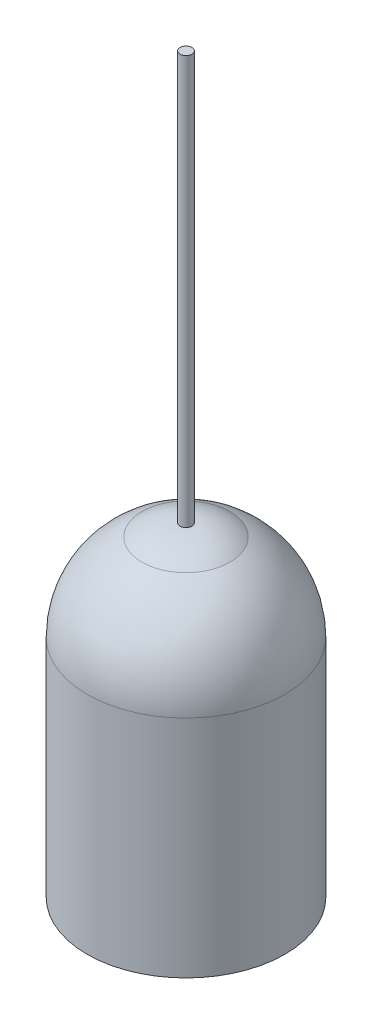
ISO-10303-21;
HEADER;
FILE_DESCRIPTION(('STEP AP214'),'2;1');
FILE_NAME('part.step','',(''),(''),'','','');
FILE_SCHEMA(('AUTOMOTIVE_DESIGN { 1 0 10303 214 1 1 1 1 }'));
ENDSEC;
DATA;
#1=APPLICATION_CONTEXT('core data for automotive mechanical design processes');
#2=APPLICATION_PROTOCOL_DEFINITION('international standard','automotive_design',2000,#1);
#3=PRODUCT_CONTEXT('',#1,'mechanical');
#4=PRODUCT('Part','Part','',(#3));
#5=PRODUCT_RELATED_PRODUCT_CATEGORY('part','',(#4));
#6=PRODUCT_DEFINITION_FORMATION('','',#4);
#7=PRODUCT_DEFINITION_CONTEXT('part definition',#1,'design');
#8=PRODUCT_DEFINITION('design','',#6,#7);
#9=PRODUCT_DEFINITION_SHAPE('','',#8);
#10=(LENGTH_UNIT() NAMED_UNIT(*) SI_UNIT(.MILLI.,.METRE.));
#11=(NAMED_UNIT(*) PLANE_ANGLE_UNIT() SI_UNIT($,.RADIAN.));
#12=(NAMED_UNIT(*) SI_UNIT($,.STERADIAN.) SOLID_ANGLE_UNIT());
#13=UNCERTAINTY_MEASURE_WITH_UNIT(LENGTH_MEASURE(1.E-05),#10,'distance_accuracy_value','');
#14=(GEOMETRIC_REPRESENTATION_CONTEXT(3) GLOBAL_UNCERTAINTY_ASSIGNED_CONTEXT((#13)) GLOBAL_UNIT_ASSIGNED_CONTEXT((#10,
#11,#12)) REPRESENTATION_CONTEXT('',''));
#15=CARTESIAN_POINT('',(0.,0.,0.));
#16=DIRECTION('',(0.,0.,1.));
#17=DIRECTION('',(1.,0.,0.));
#18=AXIS2_PLACEMENT_3D('',#15,#16,#17);
#19=CARTESIAN_POINT('',(0.,73.07610726012,16.8867086076702));
#20=DIRECTION('',(0.,-1.,0.));
#21=DIRECTION('',(0.,0.,-1.));
#22=AXIS2_PLACEMENT_3D('',#19,#20,#21);
#23=PLANE('',#22);
#24=CARTESIAN_POINT('',(0.,73.07610726012,0.));
#25=DIRECTION('',(0.,-1.,0.));
#26=DIRECTION('',(0.,0.,-1.));
#27=AXIS2_PLACEMENT_3D('',#24,#25,#26);
#28=CIRCLE('',#27,16.8867086076702);
#29=CARTESIAN_POINT('',(0.,73.07610726012,-16.8867086076702));
#30=VERTEX_POINT('',#29);
#31=EDGE_CURVE('E74',#30,#30,#28,.T.);
#32=ORIENTED_EDGE('',*,*,#31,.F.);
#33=EDGE_LOOP('',(#32));
#34=FACE_BOUND('',#33,.T.);
#35=ADVANCED_FACE('F52',(#34),#23,.F.);
#36=CARTESIAN_POINT('',(0.,29.7676170992412,-0.721295350546137));
#37=DIRECTION('',(-1.,0.,0.));
#38=DIRECTION('',(0.,0.,-1.));
#39=AXIS2_PLACEMENT_3D('',#36,#37,#38);
#40=CIRCLE('',#39,5.62162671448313);
#41=TRIMMED_CURVE('',#40,(PARAMETER_VALUE(-1.69945823867487)),
(PARAMETER_VALUE(1.69945823867487)),.T.,.PARAMETER.);
#42=CARTESIAN_POINT('',(0.,29.7676170992412,0.));
#43=DIRECTION('',(0.,-1.,0.));
#44=AXIS1_PLACEMENT('',#42,#43);
#45=SURFACE_OF_REVOLUTION('',#41,#44);
#46=CARTESIAN_POINT('',(0.,24.1924561209133,0.));
#47=VERTEX_POINT('',#46);
#48=VERTEX_LOOP('',#47);
#49=FACE_BOUND('',#48,.T.);
#50=CARTESIAN_POINT('',(0.,29.0463217486948,0.));
#51=DIRECTION('',(0.,-1.,0.));
#52=DIRECTION('',(0.,0.,-1.));
#53=AXIS2_PLACEMENT_3D('',#50,#51,#52);
#54=CIRCLE('',#53,6.29645632887407);
#55=CARTESIAN_POINT('',(0.,29.0463217486948,-6.29645632887407));
#56=VERTEX_POINT('',#55);
#57=EDGE_CURVE('E12',#56,#56,#54,.T.);
#58=ORIENTED_EDGE('',*,*,#57,.T.);
#59=EDGE_LOOP('',(#58));
#60=FACE_BOUND('',#59,.T.);
#61=ADVANCED_FACE('F61',(#49,#60),#45,.T.);
#62=CARTESIAN_POINT('',(0.,52.2124986085608,0.));
#63=DIRECTION('',(0.,-1.,0.));
#64=DIRECTION('',(0.,0.,-1.));
#65=AXIS2_PLACEMENT_3D('',#62,#63,#64);
#66=DEGENERATE_TOROIDAL_SURFACE('',#65,1.66322095690172,23.6249575727595,.T.);
#67=ORIENTED_EDGE('',*,*,#57,.F.);
#68=EDGE_LOOP('',(#67));
#69=FACE_BOUND('',#68,.T.);
#70=CARTESIAN_POINT('',(0.,56.8457339805347,0.));
#71=DIRECTION('',(0.,-1.,0.));
#72=DIRECTION('',(0.,0.,-1.));
#73=AXIS2_PLACEMENT_3D('',#70,#71,#72);
#74=CIRCLE('',#73,24.8293978167673);
#75=CARTESIAN_POINT('',(0.,56.8457339805347,-24.8293978167673));
#76=VERTEX_POINT('',#75);
#77=EDGE_CURVE('E58',#76,#76,#74,.T.);
#78=ORIENTED_EDGE('',*,*,#77,.T.);
#79=EDGE_LOOP('',(#78));
#80=FACE_BOUND('',#79,.T.);
#81=ADVANCED_FACE('F64',(#69,#80),#66,.T.);
#82=CARTESIAN_POINT('',(0.,42.9762044490012,0.));
#83=DIRECTION('',(0.,-1.,0.));
#84=DIRECTION('',(0.,0.,-1.));
#85=AXIS2_PLACEMENT_3D('',#82,#83,#84);
#86=DEGENERATE_TOROIDAL_SURFACE('',#85,24.0662967796802,50.8247262608974,.F.);
#87=ORIENTED_EDGE('',*,*,#77,.F.);
#88=EDGE_LOOP('',(#87));
#89=FACE_BOUND('',#88,.T.);
#90=ORIENTED_EDGE('',*,*,#31,.T.);
#91=EDGE_LOOP('',(#90));
#92=FACE_BOUND('',#91,.T.);
#93=ADVANCED_FACE('F69',(#89,#92),#86,.F.);
#94=CLOSED_SHELL('',(#35,#61,#81,#93));
#95=MANIFOLD_SOLID_BREP('B2',#94);
#96=CARTESIAN_POINT('',(0.,786.384,0.));
#97=DIRECTION('',(0.,-1.,0.));
#98=DIRECTION('',(0.,0.,-1.));
#99=AXIS2_PLACEMENT_3D('',#96,#97,#98);
#100=CYLINDRICAL_SURFACE('',#99,7.99332991217101);
#101=CARTESIAN_POINT('',(0.,786.384,0.));
#102=DIRECTION('',(0.,1.,0.));
#103=DIRECTION('',(0.,0.,1.));
#104=AXIS2_PLACEMENT_3D('',#101,#102,#103);
#105=CIRCLE('',#104,7.99332991217101);
#106=CARTESIAN_POINT('',(0.,786.384,7.99332991217101));
#107=VERTEX_POINT('',#106);
#108=EDGE_CURVE('E131',#107,#107,#105,.T.);
#109=ORIENTED_EDGE('',*,*,#108,.F.);
#110=EDGE_LOOP('',(#109));
#111=FACE_BOUND('',#110,.T.);
#112=CARTESIAN_POINT('',(0.,150.295678334936,0.));
#113=DIRECTION('',(0.,-1.,0.));
#114=DIRECTION('',(0.,0.,-1.));
#115=AXIS2_PLACEMENT_3D('',#112,#113,#114);
#116=CIRCLE('',#115,7.99332991217101);
#117=CARTESIAN_POINT('',(0.,150.295678334936,-7.993329912171));
#118=VERTEX_POINT('',#117);
#119=EDGE_CURVE('E126',#118,#118,#116,.T.);
#120=ORIENTED_EDGE('',*,*,#119,.F.);
#121=EDGE_LOOP('',(#120));
#122=FACE_BOUND('',#121,.T.);
#123=ADVANCED_FACE('F119',(#111,#122),#100,.T.);
#124=CARTESIAN_POINT('',(0.,786.384,0.));
#125=DIRECTION('',(0.,1.,0.));
#126=DIRECTION('',(0.,0.,1.));
#127=AXIS2_PLACEMENT_3D('',#124,#125,#126);
#128=PLANE('',#127);
#129=ORIENTED_EDGE('',*,*,#108,.T.);
#130=EDGE_LOOP('',(#129));
#131=FACE_BOUND('',#130,.T.);
#132=ADVANCED_FACE('F212',(#131),#128,.T.);
#133=CARTESIAN_POINT('',(0.,99.865256515461,0.));
#134=DIRECTION('',(0.,1.,0.));
#135=DIRECTION('',(0.,0.,1.));
#136=AXIS2_PLACEMENT_3D('',#133,#134,#135);
#137=DEGENERATE_TOROIDAL_SURFACE('',#136,1.03292821961594,51.231833665718,.F.);
#138=CARTESIAN_POINT('',(0.,141.510232001414,0.));
#139=DIRECTION('',(0.,1.,0.));
#140=DIRECTION('',(0.,0.,1.));
#141=AXIS2_PLACEMENT_3D('',#138,#139,#140);
#142=CIRCLE('',#141,28.8065891613026);
#143=CARTESIAN_POINT('',(0.,141.510232001414,28.8065891613026));
#144=VERTEX_POINT('',#143);
#145=EDGE_CURVE('E136',#144,#144,#142,.T.);
#146=ORIENTED_EDGE('',*,*,#145,.T.);
#147=EDGE_LOOP('',(#146));
#148=FACE_BOUND('',#147,.T.);
#149=ORIENTED_EDGE('',*,*,#119,.T.);
#150=EDGE_LOOP('',(#149));
#151=FACE_BOUND('',#150,.T.);
#152=ADVANCED_FACE('F217',(#148,#151),#137,.F.);
#153=CARTESIAN_POINT('',(0.,141.510232001414,0.));
#154=DIRECTION('',(0.,-1.,0.));
#155=DIRECTION('',(0.,0.,-1.));
#156=AXIS2_PLACEMENT_3D('',#153,#154,#155);
#157=PLANE('',#156);
#158=ORIENTED_EDGE('',*,*,#145,.F.);
#159=EDGE_LOOP('',(#158));
#160=FACE_BOUND('',#159,.T.);
#161=CARTESIAN_POINT('',(0.,141.510232001414,0.));
#162=DIRECTION('',(0.,1.,0.));
#163=DIRECTION('',(0.,0.,1.));
#164=AXIS2_PLACEMENT_3D('',#161,#162,#163);
#165=CIRCLE('',#164,35.3536562659767);
#166=CARTESIAN_POINT('',(0.,141.510232001414,35.3536562659767));
#167=VERTEX_POINT('',#166);
#168=EDGE_CURVE('E142',#167,#167,#165,.T.);
#169=ORIENTED_EDGE('',*,*,#168,.T.);
#170=EDGE_LOOP('',(#169));
#171=FACE_BOUND('',#170,.T.);
#172=ADVANCED_FACE('F224',(#160,#171),#157,.F.);
#173=CARTESIAN_POINT('',(0.,136.725836809537,0.));
#174=DIRECTION('',(0.,1.,0.));
#175=DIRECTION('',(0.,0.,1.));
#176=AXIS2_PLACEMENT_3D('',#173,#174,#175);
#177=TOROIDAL_SURFACE('',#176,34.5901413691782,4.84493471057054);
#178=CARTESIAN_POINT('',(0.,132.086764809024,0.));
#179=DIRECTION('',(0.,1.,0.));
#180=DIRECTION('',(0.,0.,1.));
#181=AXIS2_PLACEMENT_3D('',#178,#179,#180);
#182=CIRCLE('',#181,35.9874256365135);
#183=CARTESIAN_POINT('',(0.,132.086764809024,35.9874256365135));
#184=VERTEX_POINT('',#183);
#185=EDGE_CURVE('E146',#184,#184,#182,.T.);
#186=ORIENTED_EDGE('',*,*,#185,.T.);
#187=EDGE_LOOP('',(#186));
#188=FACE_BOUND('',#187,.T.);
#189=ORIENTED_EDGE('',*,*,#168,.F.);
#190=EDGE_LOOP('',(#189));
#191=FACE_BOUND('',#190,.T.);
#192=ADVANCED_FACE('F230',(#188,#191),#177,.T.);
#193=CARTESIAN_POINT('',(0.,79.2765226994329,0.));
#194=DIRECTION('',(0.,-1.,0.));
#195=DIRECTION('',(0.,0.,-1.));
#196=AXIS2_PLACEMENT_3D('',#193,#194,#195);
#197=CONICAL_SURFACE('',#196,70.110966691942,0.573666668168168);
#198=ORIENTED_EDGE('',*,*,#185,.F.);
#199=EDGE_LOOP('',(#198));
#200=FACE_BOUND('',#199,.T.);
#201=CARTESIAN_POINT('',(0.,79.2765226994329,0.));
#202=DIRECTION('',(0.,1.,0.));
#203=DIRECTION('',(0.,0.,1.));
#204=AXIS2_PLACEMENT_3D('',#201,#202,#203);
#205=CIRCLE('',#204,70.110966691942);
#206=CARTESIAN_POINT('',(0.,79.2765226994329,70.110966691942));
#207=VERTEX_POINT('',#206);
#208=EDGE_CURVE('E150',#207,#207,#205,.T.);
#209=ORIENTED_EDGE('',*,*,#208,.T.);
#210=EDGE_LOOP('',(#209));
#211=FACE_BOUND('',#210,.T.);
#212=ADVANCED_FACE('F234',(#200,#211),#197,.T.);
#213=CARTESIAN_POINT('',(0.,69.6270431399483,0.));
#214=DIRECTION('',(0.,1.,0.));
#215=DIRECTION('',(0.,0.,1.));
#216=AXIS2_PLACEMENT_3D('',#213,#214,#215);
#217=TOROIDAL_SURFACE('',#216,55.1772483260731,17.78);
#218=ORIENTED_EDGE('',*,*,#208,.F.);
#219=EDGE_LOOP('',(#218));
#220=FACE_BOUND('',#219,.T.);
#221=CARTESIAN_POINT('',(0.,69.6270431399482,0.));
#222=DIRECTION('',(0.,1.,0.));
#223=DIRECTION('',(0.,0.,1.));
#224=AXIS2_PLACEMENT_3D('',#221,#222,#223);
#225=CIRCLE('',#224,72.9572483260731);
#226=CARTESIAN_POINT('',(0.,69.6270431399482,72.9572483260731));
#227=VERTEX_POINT('',#226);
#228=EDGE_CURVE('E154',#227,#227,#225,.T.);
#229=ORIENTED_EDGE('',*,*,#228,.T.);
#230=EDGE_LOOP('',(#229));
#231=FACE_BOUND('',#230,.T.);
#232=ADVANCED_FACE('F238',(#220,#231),#217,.T.);
#233=CARTESIAN_POINT('',(0.,161.821544936742,0.));
#234=DIRECTION('',(0.,1.,0.));
#235=DIRECTION('',(0.,0.,1.));
#236=AXIS2_PLACEMENT_3D('',#233,#234,#235);
#237=CYLINDRICAL_SURFACE('',#236,72.9572483260731);
#238=ORIENTED_EDGE('',*,*,#228,.F.);
#239=EDGE_LOOP('',(#238));
#240=FACE_BOUND('',#239,.T.);
#241=CARTESIAN_POINT('',(0.,-79.7875614417964,0.));
#242=DIRECTION('',(0.,1.,0.));
#243=DIRECTION('',(0.,0.,1.));
#244=AXIS2_PLACEMENT_3D('',#241,#242,#243);
#245=CIRCLE('',#244,72.9572483260731);
#246=CARTESIAN_POINT('',(0.,-79.7875614417964,72.9572483260731));
#247=VERTEX_POINT('',#246);
#248=EDGE_CURVE('E158',#247,#247,#245,.T.);
#249=ORIENTED_EDGE('',*,*,#248,.T.);
#250=EDGE_LOOP('',(#249));
#251=FACE_BOUND('',#250,.T.);
#252=ADVANCED_FACE('F242',(#240,#251),#237,.T.);
#253=CARTESIAN_POINT('',(0.,-79.7875614417964,0.));
#254=DIRECTION('',(0.,-1.,0.));
#255=DIRECTION('',(0.,0.,-1.));
#256=AXIS2_PLACEMENT_3D('',#253,#254,#255);
#257=PLANE('',#256);
#258=CARTESIAN_POINT('',(0.,-79.7875614417964,0.));
#259=DIRECTION('',(0.,1.,0.));
#260=DIRECTION('',(0.,0.,1.));
#261=AXIS2_PLACEMENT_3D('',#258,#259,#260);
#262=CIRCLE('',#261,70.4172483260731);
#263=CARTESIAN_POINT('',(0.,-79.7875614417964,70.4172483260731));
#264=VERTEX_POINT('',#263);
#265=EDGE_CURVE('E162',#264,#264,#262,.T.);
#266=ORIENTED_EDGE('',*,*,#265,.T.);
#267=EDGE_LOOP('',(#266));
#268=FACE_BOUND('',#267,.T.);
#269=ORIENTED_EDGE('',*,*,#248,.F.);
#270=EDGE_LOOP('',(#269));
#271=FACE_BOUND('',#270,.T.);
#272=ADVANCED_FACE('F246',(#268,#271),#257,.T.);
#273=CARTESIAN_POINT('',(0.,161.821544936742,0.));
#274=DIRECTION('',(0.,1.,0.));
#275=DIRECTION('',(0.,0.,1.));
#276=AXIS2_PLACEMENT_3D('',#273,#274,#275);
#277=CYLINDRICAL_SURFACE('',#276,70.4172483260731);
#278=CARTESIAN_POINT('',(0.,69.6270431399482,0.));
#279=DIRECTION('',(0.,1.,0.));
#280=DIRECTION('',(0.,0.,1.));
#281=AXIS2_PLACEMENT_3D('',#278,#279,#280);
#282=CIRCLE('',#281,70.4172483260731);
#283=CARTESIAN_POINT('',(0.,69.6270431399482,70.4172483260731));
#284=VERTEX_POINT('',#283);
#285=EDGE_CURVE('E166',#284,#284,#282,.T.);
#286=ORIENTED_EDGE('',*,*,#285,.T.);
#287=EDGE_LOOP('',(#286));
#288=FACE_BOUND('',#287,.T.);
#289=ORIENTED_EDGE('',*,*,#265,.F.);
#290=EDGE_LOOP('',(#289));
#291=FACE_BOUND('',#290,.T.);
#292=ADVANCED_FACE('F250',(#288,#291),#277,.F.);
#293=CARTESIAN_POINT('',(0.,69.6270431399483,0.));
#294=DIRECTION('',(0.,1.,0.));
#295=DIRECTION('',(0.,0.,1.));
#296=AXIS2_PLACEMENT_3D('',#293,#294,#295);
#297=TOROIDAL_SURFACE('',#296,55.1772483260731,15.24);
#298=CARTESIAN_POINT('',(0.,77.8980256195065,0.));
#299=DIRECTION('',(0.,1.,0.));
#300=DIRECTION('',(0.,0.,1.));
#301=AXIS2_PLACEMENT_3D('',#298,#299,#300);
#302=CIRCLE('',#301,67.9775783539607);
#303=CARTESIAN_POINT('',(0.,77.8980256195065,67.9775783539607));
#304=VERTEX_POINT('',#303);
#305=EDGE_CURVE('E170',#304,#304,#302,.T.);
#306=ORIENTED_EDGE('',*,*,#305,.T.);
#307=EDGE_LOOP('',(#306));
#308=FACE_BOUND('',#307,.T.);
#309=ORIENTED_EDGE('',*,*,#285,.F.);
#310=EDGE_LOOP('',(#309));
#311=FACE_BOUND('',#310,.T.);
#312=ADVANCED_FACE('F254',(#308,#311),#297,.F.);
#313=CARTESIAN_POINT('',(0.,77.8980256195065,0.));
#314=DIRECTION('',(0.,-1.,0.));
#315=DIRECTION('',(0.,0.,-1.));
#316=AXIS2_PLACEMENT_3D('',#313,#314,#315);
#317=CONICAL_SURFACE('',#316,67.9775783539607,0.573666668168167);
#318=CARTESIAN_POINT('',(0.,133.78210726012,0.));
#319=DIRECTION('',(0.,1.,0.));
#320=DIRECTION('',(0.,0.,1.));
#321=AXIS2_PLACEMENT_3D('',#318,#319,#320);
#322=CIRCLE('',#321,31.8678640631023);
#323=CARTESIAN_POINT('',(0.,133.78210726012,31.8678640631023));
#324=VERTEX_POINT('',#323);
#325=EDGE_CURVE('E174',#324,#324,#322,.T.);
#326=ORIENTED_EDGE('',*,*,#325,.T.);
#327=EDGE_LOOP('',(#326));
#328=FACE_BOUND('',#327,.T.);
#329=ORIENTED_EDGE('',*,*,#305,.F.);
#330=EDGE_LOOP('',(#329));
#331=FACE_BOUND('',#330,.T.);
#332=ADVANCED_FACE('F206',(#328,#331),#317,.F.);
#333=CARTESIAN_POINT('',(0.,133.78210726012,0.));
#334=DIRECTION('',(0.,1.,0.));
#335=DIRECTION('',(0.,0.,1.));
#336=AXIS2_PLACEMENT_3D('',#333,#334,#335);
#337=PLANE('',#336);
#338=CARTESIAN_POINT('',(0.,133.78210726012,0.));
#339=DIRECTION('',(0.,1.,0.));
#340=DIRECTION('',(0.,0.,1.));
#341=AXIS2_PLACEMENT_3D('',#338,#339,#340);
#342=CIRCLE('',#341,21.5471033647638);
#343=CARTESIAN_POINT('',(0.,133.78210726012,21.5471033647638));
#344=VERTEX_POINT('',#343);
#345=EDGE_CURVE('E51',#344,#344,#342,.F.);
#346=ORIENTED_EDGE('',*,*,#345,.F.);
#347=EDGE_LOOP('',(#346));
#348=FACE_BOUND('',#347,.T.);
#349=ORIENTED_EDGE('',*,*,#325,.F.);
#350=EDGE_LOOP('',(#349));
#351=FACE_BOUND('',#350,.T.);
#352=ADVANCED_FACE('F197',(#348,#351),#337,.F.);
#353=CARTESIAN_POINT('',(0.,73.07610726012,0.));
#354=DIRECTION('',(0.,-1.,0.));
#355=DIRECTION('',(0.,0.,-1.));
#356=AXIS2_PLACEMENT_3D('',#353,#354,#355);
#357=PLANE('',#356);
#358=CARTESIAN_POINT('',(0.,73.07610726012,0.));
#359=DIRECTION('',(0.,-1.,0.));
#360=DIRECTION('',(0.,0.,-1.));
#361=AXIS2_PLACEMENT_3D('',#358,#359,#360);
#362=CIRCLE('',#361,21.5471033647638);
#363=CARTESIAN_POINT('',(0.,73.0761072601199,21.5471033647638));
#364=VERTEX_POINT('',#363);
#365=EDGE_CURVE('E178',#364,#364,#362,.T.);
#366=ORIENTED_EDGE('',*,*,#365,.T.);
#367=EDGE_LOOP('',(#366));
#368=FACE_BOUND('',#367,.T.);
#369=CARTESIAN_POINT('',(0.,73.07610726012,0.));
#370=DIRECTION('',(0.,-1.,0.));
#371=DIRECTION('',(0.,0.,-1.));
#372=AXIS2_PLACEMENT_3D('',#369,#370,#371);
#373=CIRCLE('',#372,19.0071033647638);
#374=CARTESIAN_POINT('',(0.,73.07610726012,19.0071033647638));
#375=VERTEX_POINT('',#374);
#376=EDGE_CURVE('E182',#375,#375,#373,.T.);
#377=ORIENTED_EDGE('',*,*,#376,.F.);
#378=EDGE_LOOP('',(#377));
#379=FACE_BOUND('',#378,.T.);
#380=ADVANCED_FACE('F194',(#368,#379),#357,.T.);
#381=CARTESIAN_POINT('',(0.,73.07610726012,0.));
#382=DIRECTION('',(0.,1.,0.));
#383=DIRECTION('',(0.,0.,1.));
#384=AXIS2_PLACEMENT_3D('',#381,#382,#383);
#385=CYLINDRICAL_SURFACE('',#384,21.5471033647638);
#386=CARTESIAN_POINT('',(0.,73.0761072601199,21.5471033647638));
#387=CARTESIAN_POINT('',(0.,73.7084614267866,21.5471033647638));
#388=CARTESIAN_POINT('',(0.,74.3408155934533,21.5471033647638));
#389=CARTESIAN_POINT('',(0.,75.6055239267866,21.5471033647638));
#390=CARTESIAN_POINT('',(0.,76.2378780934533,21.5471033647638));
#391=CARTESIAN_POINT('',(0.,77.5025864267866,21.5471033647638));
#392=CARTESIAN_POINT('',(0.,78.1349405934533,21.5471033647638));
#393=CARTESIAN_POINT('',(0.,79.3996489267866,21.5471033647638));
#394=CARTESIAN_POINT('',(0.,80.0320030934533,21.5471033647638));
#395=CARTESIAN_POINT('',(0.,81.2967114267866,21.5471033647638));
#396=CARTESIAN_POINT('',(0.,81.9290655934533,21.5471033647638));
#397=CARTESIAN_POINT('',(0.,83.1937739267866,21.5471033647638));
#398=CARTESIAN_POINT('',(0.,83.8261280934533,21.5471033647638));
#399=CARTESIAN_POINT('',(0.,85.0908364267866,21.5471033647638));
#400=CARTESIAN_POINT('',(0.,85.7231905934533,21.5471033647638));
#401=CARTESIAN_POINT('',(0.,86.9878989267866,21.5471033647638));
#402=CARTESIAN_POINT('',(0.,87.6202530934533,21.5471033647638));
#403=CARTESIAN_POINT('',(0.,88.8849614267866,21.5471033647638));
#404=CARTESIAN_POINT('',(0.,89.5173155934533,21.5471033647638));
#405=CARTESIAN_POINT('',(0.,90.7820239267866,21.5471033647638));
#406=CARTESIAN_POINT('',(0.,91.4143780934533,21.5471033647638));
#407=CARTESIAN_POINT('',(0.,92.6790864267866,21.5471033647638));
#408=CARTESIAN_POINT('',(0.,93.3114405934533,21.5471033647638));
#409=CARTESIAN_POINT('',(0.,94.5761489267866,21.5471033647638));
#410=CARTESIAN_POINT('',(0.,95.2085030934533,21.5471033647638));
#411=CARTESIAN_POINT('',(0.,96.4732114267866,21.5471033647638));
#412=CARTESIAN_POINT('',(0.,97.1055655934532,21.5471033647638));
#413=CARTESIAN_POINT('',(0.,98.3702739267866,21.5471033647638));
#414=CARTESIAN_POINT('',(0.,99.0026280934533,21.5471033647638));
#415=CARTESIAN_POINT('',(0.,100.267336426787,21.5471033647638));
#416=CARTESIAN_POINT('',(0.,100.899690593453,21.5471033647638));
#417=CARTESIAN_POINT('',(0.,102.164398926787,21.5471033647638));
#418=CARTESIAN_POINT('',(0.,102.796753093453,21.5471033647638));
#419=CARTESIAN_POINT('',(0.,104.061461426787,21.5471033647638));
#420=CARTESIAN_POINT('',(0.,104.693815593453,21.5471033647638));
#421=CARTESIAN_POINT('',(0.,105.958523926787,21.5471033647638));
#422=CARTESIAN_POINT('',(0.,106.590878093453,21.5471033647638));
#423=CARTESIAN_POINT('',(0.,107.855586426787,21.5471033647638));
#424=CARTESIAN_POINT('',(0.,108.487940593453,21.5471033647638));
#425=CARTESIAN_POINT('',(0.,109.752648926787,21.5471033647638));
#426=CARTESIAN_POINT('',(0.,110.385003093453,21.5471033647638));
#427=CARTESIAN_POINT('',(0.,111.649711426787,21.5471033647638));
#428=CARTESIAN_POINT('',(0.,112.282065593453,21.5471033647638));
#429=CARTESIAN_POINT('',(0.,113.546773926787,21.5471033647638));
#430=CARTESIAN_POINT('',(0.,114.179128093453,21.5471033647638));
#431=CARTESIAN_POINT('',(0.,115.443836426787,21.5471033647638));
#432=CARTESIAN_POINT('',(0.,116.076190593453,21.5471033647638));
#433=CARTESIAN_POINT('',(0.,117.340898926787,21.5471033647638));
#434=CARTESIAN_POINT('',(0.,117.973253093453,21.5471033647638));
#435=CARTESIAN_POINT('',(0.,119.237961426787,21.5471033647638));
#436=CARTESIAN_POINT('',(0.,119.870315593453,21.5471033647638));
#437=CARTESIAN_POINT('',(0.,121.135023926787,21.5471033647638));
#438=CARTESIAN_POINT('',(0.,121.767378093453,21.5471033647638));
#439=CARTESIAN_POINT('',(0.,123.032086426787,21.5471033647638));
#440=CARTESIAN_POINT('',(0.,123.664440593453,21.5471033647638));
#441=CARTESIAN_POINT('',(0.,124.929148926787,21.5471033647638));
#442=CARTESIAN_POINT('',(0.,125.561503093453,21.5471033647638));
#443=CARTESIAN_POINT('',(0.,126.826211426787,21.5471033647638));
#444=CARTESIAN_POINT('',(0.,127.458565593453,21.5471033647638));
#445=CARTESIAN_POINT('',(0.,128.723273926787,21.5471033647638));
#446=CARTESIAN_POINT('',(0.,129.355628093453,21.5471033647638));
#447=CARTESIAN_POINT('',(0.,130.620336426787,21.5471033647638));
#448=CARTESIAN_POINT('',(0.,131.252690593453,21.5471033647638));
#449=CARTESIAN_POINT('',(0.,132.517398926787,21.5471033647638));
#450=CARTESIAN_POINT('',(0.,133.149753093453,21.5471033647638));
#451=CARTESIAN_POINT('',(0.,133.78210726012,21.5471033647638));
#452=B_SPLINE_CURVE_WITH_KNOTS('',3,(#386,#387,#388,#389,#390,#391,#392,#393,#394,#395,#396,
#397,#398,#399,#400,#401,#402,#403,#404,#405,#406,#407,#408,#409,#410,#411,#412,#413,#414,#415,
#416,#417,#418,#419,#420,#421,#422,#423,#424,#425,#426,#427,#428,#429,#430,#431,#432,#433,#434,
#435,#436,#437,#438,#439,#440,#441,#442,#443,#444,#445,#446,#447,#448,#449,#450,#451),
.UNSPECIFIED.,.F.,.F.,(4,2,2,2,2,2,2,2,2,2,2,2,2,2,2,2,2,2,2,2,2,2,2,2,2,2,2,2,2,2,2,2,4),(0.,
1.8970625,3.79412500000001,5.6911875,7.58825,9.4853125,11.382375,13.2794375,15.1765,17.0735625,
18.970625,20.8676875,22.76475,24.6618125,26.558875,28.4559375,30.353,32.2500625,34.147125,
36.0441875,37.94125,39.8383125,41.735375,43.6324375,45.5295,47.4265625,49.323625,51.2206875,
53.11775,55.0148124999999,56.911875,58.8089374999999,60.7059999999999),.UNSPECIFIED.);
#453=EDGE_CURVE('BSEAM196',#364,#344,#452,.T.);
#454=ORIENTED_EDGE('',*,*,#365,.F.);
#455=ORIENTED_EDGE('',*,*,#345,.T.);
#456=ORIENTED_EDGE('',*,*,#453,.T.);
#457=ORIENTED_EDGE('',*,*,#453,.F.);
#458=EDGE_LOOP('',(#454,#456,#455,#457));
#459=FACE_BOUND('',#458,.T.);
#460=ADVANCED_FACE('F196',(#459),#385,.T.);
#461=CARTESIAN_POINT('',(0.,73.07610726012,0.));
#462=DIRECTION('',(0.,1.,0.));
#463=DIRECTION('',(0.,0.,1.));
#464=AXIS2_PLACEMENT_3D('',#461,#462,#463);
#465=CYLINDRICAL_SURFACE('',#464,19.0071033647638);
#466=CARTESIAN_POINT('',(0.,133.78210726012,0.));
#467=DIRECTION('',(0.,-1.,0.));
#468=DIRECTION('',(0.,0.,-1.));
#469=AXIS2_PLACEMENT_3D('',#466,#467,#468);
#470=CIRCLE('',#469,19.0071033647638);
#471=CARTESIAN_POINT('',(0.,133.78210726012,19.0071033647638));
#472=VERTEX_POINT('',#471);
#473=EDGE_CURVE('E183',#472,#472,#470,.T.);
#474=CARTESIAN_POINT('',(0.,73.07610726012,19.0071033647638));
#475=CARTESIAN_POINT('',(0.,73.7084614267866,19.0071033647638));
#476=CARTESIAN_POINT('',(0.,74.3408155934533,19.0071033647638));
#477=CARTESIAN_POINT('',(0.,75.6055239267866,19.0071033647638));
#478=CARTESIAN_POINT('',(0.,76.2378780934533,19.0071033647638));
#479=CARTESIAN_POINT('',(0.,77.5025864267866,19.0071033647638));
#480=CARTESIAN_POINT('',(0.,78.1349405934533,19.0071033647638));
#481=CARTESIAN_POINT('',(0.,79.3996489267866,19.0071033647638));
#482=CARTESIAN_POINT('',(0.,80.0320030934533,19.0071033647638));
#483=CARTESIAN_POINT('',(0.,81.2967114267866,19.0071033647638));
#484=CARTESIAN_POINT('',(0.,81.9290655934533,19.0071033647638));
#485=CARTESIAN_POINT('',(0.,83.1937739267866,19.0071033647638));
#486=CARTESIAN_POINT('',(0.,83.8261280934533,19.0071033647638));
#487=CARTESIAN_POINT('',(0.,85.0908364267866,19.0071033647638));
#488=CARTESIAN_POINT('',(0.,85.7231905934533,19.0071033647638));
#489=CARTESIAN_POINT('',(0.,86.9878989267866,19.0071033647638));
#490=CARTESIAN_POINT('',(0.,87.6202530934533,19.0071033647638));
#491=CARTESIAN_POINT('',(0.,88.8849614267866,19.0071033647638));
#492=CARTESIAN_POINT('',(0.,89.5173155934533,19.0071033647638));
#493=CARTESIAN_POINT('',(0.,90.7820239267866,19.0071033647638));
#494=CARTESIAN_POINT('',(0.,91.4143780934533,19.0071033647638));
#495=CARTESIAN_POINT('',(0.,92.6790864267866,19.0071033647638));
#496=CARTESIAN_POINT('',(0.,93.3114405934533,19.0071033647638));
#497=CARTESIAN_POINT('',(0.,94.5761489267866,19.0071033647638));
#498=CARTESIAN_POINT('',(0.,95.2085030934533,19.0071033647638));
#499=CARTESIAN_POINT('',(0.,96.4732114267866,19.0071033647638));
#500=CARTESIAN_POINT('',(0.,97.1055655934532,19.0071033647638));
#501=CARTESIAN_POINT('',(0.,98.3702739267866,19.0071033647638));
#502=CARTESIAN_POINT('',(0.,99.0026280934533,19.0071033647638));
#503=CARTESIAN_POINT('',(0.,100.267336426787,19.0071033647638));
#504=CARTESIAN_POINT('',(0.,100.899690593453,19.0071033647638));
#505=CARTESIAN_POINT('',(0.,102.164398926787,19.0071033647638));
#506=CARTESIAN_POINT('',(0.,102.796753093453,19.0071033647638));
#507=CARTESIAN_POINT('',(0.,104.061461426787,19.0071033647638));
#508=CARTESIAN_POINT('',(0.,104.693815593453,19.0071033647638));
#509=CARTESIAN_POINT('',(0.,105.958523926787,19.0071033647638));
#510=CARTESIAN_POINT('',(0.,106.590878093453,19.0071033647638));
#511=CARTESIAN_POINT('',(0.,107.855586426787,19.0071033647638));
#512=CARTESIAN_POINT('',(0.,108.487940593453,19.0071033647638));
#513=CARTESIAN_POINT('',(0.,109.752648926787,19.0071033647638));
#514=CARTESIAN_POINT('',(0.,110.385003093453,19.0071033647638));
#515=CARTESIAN_POINT('',(0.,111.649711426787,19.0071033647638));
#516=CARTESIAN_POINT('',(0.,112.282065593453,19.0071033647638));
#517=CARTESIAN_POINT('',(0.,113.546773926787,19.0071033647638));
#518=CARTESIAN_POINT('',(0.,114.179128093453,19.0071033647638));
#519=CARTESIAN_POINT('',(0.,115.443836426787,19.0071033647638));
#520=CARTESIAN_POINT('',(0.,116.076190593453,19.0071033647638));
#521=CARTESIAN_POINT('',(0.,117.340898926787,19.0071033647638));
#522=CARTESIAN_POINT('',(0.,117.973253093453,19.0071033647638));
#523=CARTESIAN_POINT('',(0.,119.237961426787,19.0071033647638));
#524=CARTESIAN_POINT('',(0.,119.870315593453,19.0071033647638));
#525=CARTESIAN_POINT('',(0.,121.135023926787,19.0071033647638));
#526=CARTESIAN_POINT('',(0.,121.767378093453,19.0071033647638));
#527=CARTESIAN_POINT('',(0.,123.032086426787,19.0071033647638));
#528=CARTESIAN_POINT('',(0.,123.664440593453,19.0071033647638));
#529=CARTESIAN_POINT('',(0.,124.929148926787,19.0071033647638));
#530=CARTESIAN_POINT('',(0.,125.561503093453,19.0071033647638));
#531=CARTESIAN_POINT('',(0.,126.826211426787,19.0071033647638));
#532=CARTESIAN_POINT('',(0.,127.458565593453,19.0071033647638));
#533=CARTESIAN_POINT('',(0.,128.723273926787,19.0071033647638));
#534=CARTESIAN_POINT('',(0.,129.355628093453,19.0071033647638));
#535=CARTESIAN_POINT('',(0.,130.620336426787,19.0071033647638));
#536=CARTESIAN_POINT('',(0.,131.252690593453,19.0071033647638));
#537=CARTESIAN_POINT('',(0.,132.517398926787,19.0071033647638));
#538=CARTESIAN_POINT('',(0.,133.149753093453,19.0071033647638));
#539=CARTESIAN_POINT('',(0.,133.78210726012,19.0071033647638));
#540=B_SPLINE_CURVE_WITH_KNOTS('',3,(#474,#475,#476,#477,#478,#479,#480,#481,#482,#483,#484,
#485,#486,#487,#488,#489,#490,#491,#492,#493,#494,#495,#496,#497,#498,#499,#500,#501,#502,#503,
#504,#505,#506,#507,#508,#509,#510,#511,#512,#513,#514,#515,#516,#517,#518,#519,#520,#521,#522,
#523,#524,#525,#526,#527,#528,#529,#530,#531,#532,#533,#534,#535,#536,#537,#538,#539),
.UNSPECIFIED.,.F.,.F.,(4,2,2,2,2,2,2,2,2,2,2,2,2,2,2,2,2,2,2,2,2,2,2,2,2,2,2,2,2,2,2,2,4),(0.,
1.89706249999999,3.794125,5.69118749999999,7.58824999999999,9.48531249999998,11.382375,
13.2794375,15.1765,17.0735625,18.970625,20.8676875,22.76475,24.6618125,26.558875,28.4559375,
30.353,32.2500625,34.147125,36.0441875,37.94125,39.8383124999999,41.7353749999999,43.6324375,
45.5294999999999,47.4265624999999,49.3236249999999,51.2206874999999,53.1177499999999,
55.0148124999999,56.9118749999999,58.8089374999999,60.7059999999999),.UNSPECIFIED.);
#541=EDGE_CURVE('BSEAM191',#375,#472,#540,.T.);
#542=ORIENTED_EDGE('',*,*,#376,.T.);
#543=ORIENTED_EDGE('',*,*,#473,.F.);
#544=ORIENTED_EDGE('',*,*,#541,.T.);
#545=ORIENTED_EDGE('',*,*,#541,.F.);
#546=EDGE_LOOP('',(#542,#544,#543,#545));
#547=FACE_BOUND('',#546,.T.);
#548=ADVANCED_FACE('F191',(#547),#465,.F.);
#549=ORIENTED_EDGE('',*,*,#473,.T.);
#550=EDGE_LOOP('',(#549));
#551=FACE_BOUND('',#550,.T.);
#552=ADVANCED_FACE('F209',(#551),#337,.F.);
#553=CLOSED_SHELL('',(#123,#132,#152,#172,#192,#212,#232,#252,#272,#292,#312,#332,#352,#380,
#460,#548,#552));
#554=MANIFOLD_SOLID_BREP('B6',#553);
#555=CARTESIAN_POINT('',(0.,98.6327102803739,0.));
#556=DIRECTION('',(0.,1.,0.));
#557=DIRECTION('',(0.,0.,1.));
#558=AXIS2_PLACEMENT_3D('',#555,#556,#557);
#559=DEGENERATE_TOROIDAL_SURFACE('',#558,3.20039526857052,130.683716880962,.T.);
#560=CARTESIAN_POINT('',(0.,98.6327102803738,0.));
#561=DIRECTION('',(0.,1.,0.));
#562=DIRECTION('',(0.,0.,1.));
#563=AXIS2_PLACEMENT_3D('',#560,#561,#562);
#564=CIRCLE('',#563,133.884112149533);
#565=CARTESIAN_POINT('',(0.,98.6327102803738,133.884112149533));
#566=VERTEX_POINT('',#565);
#567=EDGE_CURVE('E449',#566,#566,#564,.T.);
#568=ORIENTED_EDGE('',*,*,#567,.T.);
#569=EDGE_LOOP('',(#568));
#570=FACE_BOUND('',#569,.T.);
#571=CARTESIAN_POINT('',(0.,216.515790231292,0.));
#572=DIRECTION('',(0.,1.,0.));
#573=DIRECTION('',(0.,0.,1.));
#574=AXIS2_PLACEMENT_3D('',#571,#572,#573);
#575=CIRCLE('',#574,59.607959647019);
#576=CARTESIAN_POINT('',(0.,216.515790231292,59.607959647019));
#577=VERTEX_POINT('',#576);
#578=EDGE_CURVE('E117',#577,#577,#575,.T.);
#579=ORIENTED_EDGE('',*,*,#578,.F.);
#580=EDGE_LOOP('',(#579));
#581=FACE_BOUND('',#580,.T.);
#582=ADVANCED_FACE('F409',(#570,#581),#559,.T.);
#583=CARTESIAN_POINT('',(0.,146.251683739962,8.79479324002292));
#584=DIRECTION('',(-1.,0.,0.));
#585=DIRECTION('',(0.,0.,1.));
#586=AXIS2_PLACEMENT_3D('',#583,#584,#585);
#587=CIRCLE('',#586,86.7122975207672);
#588=TRIMMED_CURVE('',#587,(PARAMETER_VALUE(-1.67239601261547)),
(PARAMETER_VALUE(1.67239601261547)),.T.,.PARAMETER.);
#589=CARTESIAN_POINT('',(0.,146.251683739962,0.));
#590=DIRECTION('',(0.,1.,0.));
#591=AXIS1_PLACEMENT('',#589,#590);
#592=SURFACE_OF_REVOLUTION('',#588,#591);
#593=ORIENTED_EDGE('',*,*,#578,.T.);
#594=EDGE_LOOP('',(#593));
#595=FACE_BOUND('',#594,.T.);
#596=CARTESIAN_POINT('',(0.,232.516822429907,0.));
#597=VERTEX_POINT('',#596);
#598=VERTEX_LOOP('',#597);
#599=FACE_BOUND('',#598,.T.);
#600=ADVANCED_FACE('F439',(#595,#599),#592,.T.);
#601=CARTESIAN_POINT('',(-133.884112149533,-206.167289719626,0.));
#602=DIRECTION('',(0.,-1.,0.));
#603=DIRECTION('',(0.,0.,-1.));
#604=AXIS2_PLACEMENT_3D('',#601,#602,#603);
#605=PLANE('',#604);
#606=CARTESIAN_POINT('',(0.,-206.167289719626,0.));
#607=DIRECTION('',(0.,-1.,0.));
#608=DIRECTION('',(0.,0.,-1.));
#609=AXIS2_PLACEMENT_3D('',#606,#607,#608);
#610=CIRCLE('',#609,127.534112149533);
#611=CARTESIAN_POINT('',(0.,-206.167289719626,-127.534112149533));
#612=VERTEX_POINT('',#611);
#613=EDGE_CURVE('E456',#612,#612,#610,.F.);
#614=ORIENTED_EDGE('',*,*,#613,.T.);
#615=EDGE_LOOP('',(#614));
#616=FACE_BOUND('',#615,.T.);
#617=CARTESIAN_POINT('',(0.,-206.167289719626,0.));
#618=DIRECTION('',(0.,1.,0.));
#619=DIRECTION('',(0.,0.,1.));
#620=AXIS2_PLACEMENT_3D('',#617,#618,#619);
#621=CIRCLE('',#620,133.884112149533);
#622=CARTESIAN_POINT('',(0.,-206.167289719626,133.884112149533));
#623=VERTEX_POINT('',#622);
#624=EDGE_CURVE('E416',#623,#623,#621,.T.);
#625=ORIENTED_EDGE('',*,*,#624,.F.);
#626=EDGE_LOOP('',(#625));
#627=FACE_BOUND('',#626,.T.);
#628=ADVANCED_FACE('F444',(#616,#627),#605,.T.);
#629=CARTESIAN_POINT('',(0.,159.877570093458,0.));
#630=DIRECTION('',(0.,1.,0.));
#631=DIRECTION('',(0.,0.,1.));
#632=AXIS2_PLACEMENT_3D('',#629,#630,#631);
#633=CYLINDRICAL_SURFACE('',#632,133.884112149533);
#634=ORIENTED_EDGE('',*,*,#624,.T.);
#635=EDGE_LOOP('',(#634));
#636=FACE_BOUND('',#635,.T.);
#637=ORIENTED_EDGE('',*,*,#567,.F.);
#638=EDGE_LOOP('',(#637));
#639=FACE_BOUND('',#638,.T.);
#640=ADVANCED_FACE('F434',(#636,#639),#633,.T.);
#641=CARTESIAN_POINT('',(0.,98.6327102803739,0.));
#642=DIRECTION('',(0.,1.,0.));
#643=DIRECTION('',(0.,0.,1.));
#644=AXIS2_PLACEMENT_3D('',#641,#642,#643);
#645=DEGENERATE_TOROIDAL_SURFACE('',#644,3.20039526857052,124.333716880962,.T.);
#646=CARTESIAN_POINT('',(0.,98.6327102803738,0.));
#647=DIRECTION('',(0.,1.,0.));
#648=DIRECTION('',(0.,0.,1.));
#649=AXIS2_PLACEMENT_3D('',#646,#647,#648);
#650=CIRCLE('',#649,127.534112149533);
#651=CARTESIAN_POINT('',(0.,98.6327102803738,127.534112149533));
#652=VERTEX_POINT('',#651);
#653=EDGE_CURVE('E460',#652,#652,#650,.T.);
#654=ORIENTED_EDGE('',*,*,#653,.F.);
#655=EDGE_LOOP('',(#654));
#656=FACE_BOUND('',#655,.T.);
#657=CARTESIAN_POINT('',(0.,211.035342568037,0.));
#658=DIRECTION('',(0.,1.,0.));
#659=DIRECTION('',(0.,0.,1.));
#660=AXIS2_PLACEMENT_3D('',#657,#658,#659);
#661=CIRCLE('',#660,56.3466219289801);
#662=CARTESIAN_POINT('',(0.,211.035342568037,56.3466219289801));
#663=VERTEX_POINT('',#662);
#664=EDGE_CURVE('E452',#663,#663,#661,.T.);
#665=ORIENTED_EDGE('',*,*,#664,.T.);
#666=EDGE_LOOP('',(#665));
#667=FACE_BOUND('',#666,.T.);
#668=ADVANCED_FACE('F425',(#656,#667),#645,.F.);
#669=CARTESIAN_POINT('',(0.,146.251683739962,8.79479324002292));
#670=DIRECTION('',(-1.,0.,0.));
#671=DIRECTION('',(0.,0.,1.));
#672=AXIS2_PLACEMENT_3D('',#669,#670,#671);
#673=CIRCLE('',#672,80.3622975207672);
#674=TRIMMED_CURVE('',#673,(PARAMETER_VALUE(-1.6804552666836)),
(PARAMETER_VALUE(1.6804552666836)),.T.,.PARAMETER.);
#675=CARTESIAN_POINT('',(0.,146.251683739962,0.));
#676=DIRECTION('',(0.,1.,0.));
#677=AXIS1_PLACEMENT('',#675,#676);
#678=SURFACE_OF_REVOLUTION('',#674,#677);
#679=ORIENTED_EDGE('',*,*,#664,.F.);
#680=EDGE_LOOP('',(#679));
#681=FACE_BOUND('',#680,.T.);
#682=CARTESIAN_POINT('',(0.,226.13128360552,0.));
#683=VERTEX_POINT('',#682);
#684=VERTEX_LOOP('',#683);
#685=FACE_BOUND('',#684,.T.);
#686=ADVANCED_FACE('F422',(#681,#685),#678,.F.);
#687=CARTESIAN_POINT('',(0.,159.877570093458,0.));
#688=DIRECTION('',(0.,1.,0.));
#689=DIRECTION('',(0.,0.,1.));
#690=AXIS2_PLACEMENT_3D('',#687,#688,#689);
#691=CYLINDRICAL_SURFACE('',#690,127.534112149533);
#692=ORIENTED_EDGE('',*,*,#613,.F.);
#693=EDGE_LOOP('',(#692));
#694=FACE_BOUND('',#693,.T.);
#695=ORIENTED_EDGE('',*,*,#653,.T.);
#696=EDGE_LOOP('',(#695));
#697=FACE_BOUND('',#696,.T.);
#698=ADVANCED_FACE('F424',(#694,#697),#691,.F.);
#699=CLOSED_SHELL('',(#582,#600,#628,#640,#668,#686,#698));
#700=MANIFOLD_SOLID_BREP('B46',#699);
#701=ADVANCED_BREP_SHAPE_REPRESENTATION('',(#18,#95,#554,#700),#14);
#702=SHAPE_DEFINITION_REPRESENTATION(#9,#701);
ENDSEC;
END-ISO-10303-21;
